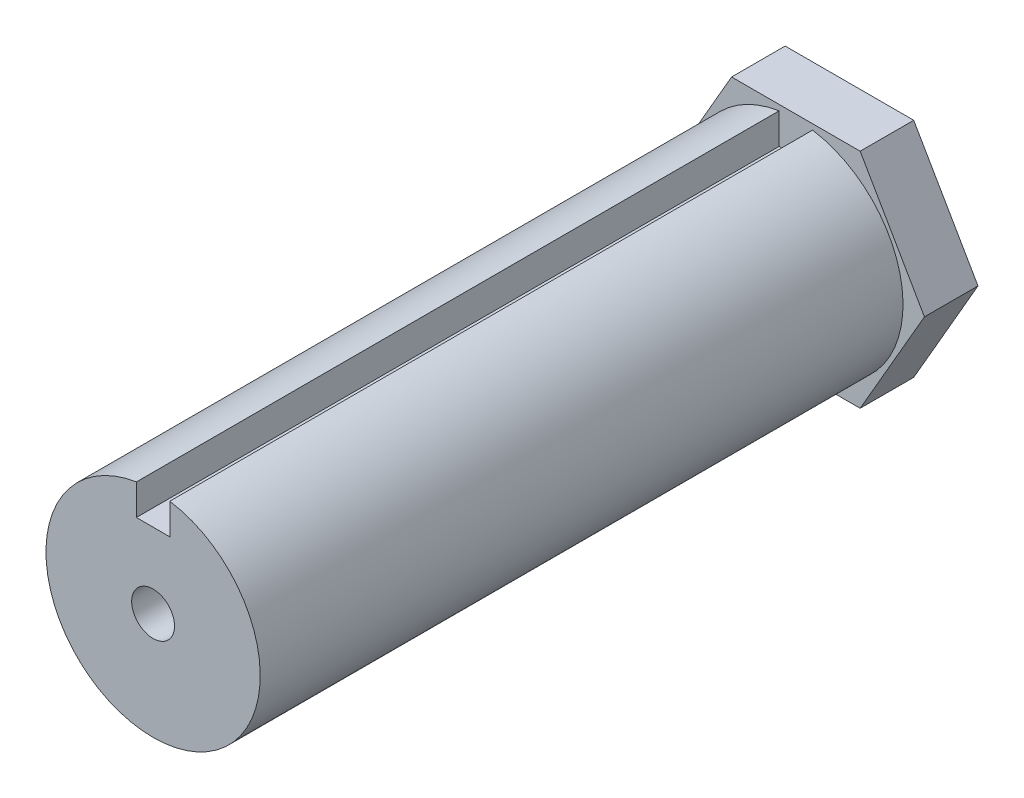
ISO-10303-21;
HEADER;
FILE_DESCRIPTION(('STEP AP214'),'2;1');
FILE_NAME('part.step','',(''),(''),'','','');
FILE_SCHEMA(('AUTOMOTIVE_DESIGN { 1 0 10303 214 1 1 1 1 }'));
ENDSEC;
DATA;
#1=APPLICATION_CONTEXT('core data for automotive mechanical design processes');
#2=APPLICATION_PROTOCOL_DEFINITION('international standard','automotive_design',2000,#1);
#3=PRODUCT_CONTEXT('',#1,'mechanical');
#4=PRODUCT('Part','Part','',(#3));
#5=PRODUCT_RELATED_PRODUCT_CATEGORY('part','',(#4));
#6=PRODUCT_DEFINITION_FORMATION('','',#4);
#7=PRODUCT_DEFINITION_CONTEXT('part definition',#1,'design');
#8=PRODUCT_DEFINITION('design','',#6,#7);
#9=PRODUCT_DEFINITION_SHAPE('','',#8);
#10=(LENGTH_UNIT() NAMED_UNIT(*) SI_UNIT(.MILLI.,.METRE.));
#11=(NAMED_UNIT(*) PLANE_ANGLE_UNIT() SI_UNIT($,.RADIAN.));
#12=(NAMED_UNIT(*) SI_UNIT($,.STERADIAN.) SOLID_ANGLE_UNIT());
#13=UNCERTAINTY_MEASURE_WITH_UNIT(LENGTH_MEASURE(1.E-05),#10,'distance_accuracy_value','');
#14=(GEOMETRIC_REPRESENTATION_CONTEXT(3) GLOBAL_UNCERTAINTY_ASSIGNED_CONTEXT((#13)) GLOBAL_UNIT_ASSIGNED_CONTEXT((#10,
#11,#12)) REPRESENTATION_CONTEXT('',''));
#15=CARTESIAN_POINT('',(0.,0.,0.));
#16=DIRECTION('',(0.,0.,1.));
#17=DIRECTION('',(1.,0.,0.));
#18=AXIS2_PLACEMENT_3D('',#15,#16,#17);
#19=CARTESIAN_POINT('',(12.,0.,5.));
#20=DIRECTION('',(-0.866025403784435,-0.500000000000007,0.));
#21=DIRECTION('',(0.500000000000007,-0.866025403784435,0.));
#22=AXIS2_PLACEMENT_3D('',#19,#20,#21);
#23=PLANE('',#22);
#24=DIRECTION('',(-0.500000000000007,0.866025403784435,0.));
#25=VECTOR('',#24,1.);
#26=CARTESIAN_POINT('',(12.,0.,0.));
#27=LINE('',#26,#25);
#28=CARTESIAN_POINT('',(12.,0.,0.));
#29=VERTEX_POINT('',#28);
#30=CARTESIAN_POINT('',(5.99999999999992,10.3923048454133,0.));
#31=VERTEX_POINT('',#30);
#32=EDGE_CURVE('E128',#29,#31,#27,.T.);
#33=ORIENTED_EDGE('',*,*,#32,.T.);
#34=DIRECTION('',(0.,0.,-1.));
#35=VECTOR('',#34,1.);
#36=CARTESIAN_POINT('',(5.99999999999992,10.3923048454133,5.));
#37=LINE('',#36,#35);
#38=CARTESIAN_POINT('',(5.99999999999992,10.3923048454133,5.));
#39=VERTEX_POINT('',#38);
#40=EDGE_CURVE('E39',#39,#31,#37,.T.);
#41=ORIENTED_EDGE('',*,*,#40,.F.);
#42=DIRECTION('',(-0.500000000000007,0.866025403784435,0.));
#43=VECTOR('',#42,1.);
#44=CARTESIAN_POINT('',(12.,0.,5.));
#45=LINE('',#44,#43);
#46=CARTESIAN_POINT('',(12.,0.,5.));
#47=VERTEX_POINT('',#46);
#48=EDGE_CURVE('E140',#47,#39,#45,.T.);
#49=ORIENTED_EDGE('',*,*,#48,.F.);
#50=DIRECTION('',(0.,0.,-1.));
#51=VECTOR('',#50,1.);
#52=CARTESIAN_POINT('',(12.,0.,5.));
#53=LINE('',#52,#51);
#54=EDGE_CURVE('E124',#47,#29,#53,.T.);
#55=ORIENTED_EDGE('',*,*,#54,.T.);
#56=EDGE_LOOP('',(#33,#41,#49,#55));
#57=FACE_BOUND('',#56,.T.);
#58=ADVANCED_FACE('F32',(#57),#23,.F.);
#59=CARTESIAN_POINT('',(5.99999999999992,10.3923048454133,5.));
#60=DIRECTION('',(0.,-1.,0.));
#61=DIRECTION('',(1.,0.,0.));
#62=AXIS2_PLACEMENT_3D('',#59,#60,#61);
#63=PLANE('',#62);
#64=DIRECTION('',(-1.,0.,0.));
#65=VECTOR('',#64,1.);
#66=CARTESIAN_POINT('',(5.99999999999992,10.3923048454133,0.));
#67=LINE('',#66,#65);
#68=CARTESIAN_POINT('',(-6.00000000000008,10.3923048454132,0.));
#69=VERTEX_POINT('',#68);
#70=EDGE_CURVE('E131',#31,#69,#67,.T.);
#71=ORIENTED_EDGE('',*,*,#70,.T.);
#72=DIRECTION('',(0.,0.,-1.));
#73=VECTOR('',#72,1.);
#74=CARTESIAN_POINT('',(-6.00000000000008,10.3923048454132,5.));
#75=LINE('',#74,#73);
#76=CARTESIAN_POINT('',(-6.00000000000008,10.3923048454132,5.));
#77=VERTEX_POINT('',#76);
#78=EDGE_CURVE('E144',#77,#69,#75,.T.);
#79=ORIENTED_EDGE('',*,*,#78,.F.);
#80=DIRECTION('',(-1.,0.,0.));
#81=VECTOR('',#80,1.);
#82=CARTESIAN_POINT('',(5.99999999999992,10.3923048454133,5.));
#83=LINE('',#82,#81);
#84=EDGE_CURVE('E90',#39,#77,#83,.T.);
#85=ORIENTED_EDGE('',*,*,#84,.F.);
#86=ORIENTED_EDGE('',*,*,#40,.T.);
#87=EDGE_LOOP('',(#71,#79,#85,#86));
#88=FACE_BOUND('',#87,.T.);
#89=ADVANCED_FACE('F147',(#88),#63,.F.);
#90=CARTESIAN_POINT('',(-6.00000000000008,10.3923048454132,5.));
#91=DIRECTION('',(0.866025403784443,-0.499999999999993,0.));
#92=DIRECTION('',(0.499999999999993,0.866025403784443,0.));
#93=AXIS2_PLACEMENT_3D('',#90,#91,#92);
#94=PLANE('',#93);
#95=DIRECTION('',(-0.499999999999993,-0.866025403784443,0.));
#96=VECTOR('',#95,1.);
#97=CARTESIAN_POINT('',(-6.00000000000008,10.3923048454132,0.));
#98=LINE('',#97,#96);
#99=CARTESIAN_POINT('',(-12.,0.,0.));
#100=VERTEX_POINT('',#99);
#101=EDGE_CURVE('E134',#69,#100,#98,.T.);
#102=ORIENTED_EDGE('',*,*,#101,.T.);
#103=DIRECTION('',(0.,0.,-1.));
#104=VECTOR('',#103,1.);
#105=CARTESIAN_POINT('',(-12.,0.,5.));
#106=LINE('',#105,#104);
#107=CARTESIAN_POINT('',(-12.,0.,5.));
#108=VERTEX_POINT('',#107);
#109=EDGE_CURVE('E119',#108,#100,#106,.T.);
#110=ORIENTED_EDGE('',*,*,#109,.F.);
#111=DIRECTION('',(-0.499999999999993,-0.866025403784443,0.));
#112=VECTOR('',#111,1.);
#113=CARTESIAN_POINT('',(-6.00000000000008,10.3923048454132,5.));
#114=LINE('',#113,#112);
#115=EDGE_CURVE('E107',#77,#108,#114,.T.);
#116=ORIENTED_EDGE('',*,*,#115,.F.);
#117=ORIENTED_EDGE('',*,*,#78,.T.);
#118=EDGE_LOOP('',(#102,#110,#116,#117));
#119=FACE_BOUND('',#118,.T.);
#120=ADVANCED_FACE('F155',(#119),#94,.F.);
#121=CARTESIAN_POINT('',(-12.,0.,5.));
#122=DIRECTION('',(0.866025403784434,0.500000000000007,0.));
#123=DIRECTION('',(-0.500000000000007,0.866025403784434,0.));
#124=AXIS2_PLACEMENT_3D('',#121,#122,#123);
#125=PLANE('',#124);
#126=DIRECTION('',(0.500000000000007,-0.866025403784434,0.));
#127=VECTOR('',#126,1.);
#128=CARTESIAN_POINT('',(-12.,0.,0.));
#129=LINE('',#128,#127);
#130=CARTESIAN_POINT('',(-5.99999999999991,-10.3923048454133,0.));
#131=VERTEX_POINT('',#130);
#132=EDGE_CURVE('E116',#100,#131,#129,.T.);
#133=ORIENTED_EDGE('',*,*,#132,.T.);
#134=DIRECTION('',(0.,0.,-1.));
#135=VECTOR('',#134,1.);
#136=CARTESIAN_POINT('',(-5.99999999999991,-10.3923048454133,5.));
#137=LINE('',#136,#135);
#138=CARTESIAN_POINT('',(-5.99999999999991,-10.3923048454133,5.));
#139=VERTEX_POINT('',#138);
#140=EDGE_CURVE('E113',#139,#131,#137,.T.);
#141=ORIENTED_EDGE('',*,*,#140,.F.);
#142=DIRECTION('',(0.500000000000007,-0.866025403784434,0.));
#143=VECTOR('',#142,1.);
#144=CARTESIAN_POINT('',(-12.,0.,5.));
#145=LINE('',#144,#143);
#146=EDGE_CURVE('E99',#108,#139,#145,.T.);
#147=ORIENTED_EDGE('',*,*,#146,.F.);
#148=ORIENTED_EDGE('',*,*,#109,.T.);
#149=EDGE_LOOP('',(#133,#141,#147,#148));
#150=FACE_BOUND('',#149,.T.);
#151=ADVANCED_FACE('F114',(#150),#125,.F.);
#152=CARTESIAN_POINT('',(-5.99999999999991,-10.3923048454133,5.));
#153=DIRECTION('',(0.,1.,0.));
#154=DIRECTION('',(-1.,0.,0.));
#155=AXIS2_PLACEMENT_3D('',#152,#153,#154);
#156=PLANE('',#155);
#157=DIRECTION('',(1.,0.,0.));
#158=VECTOR('',#157,1.);
#159=CARTESIAN_POINT('',(-5.99999999999991,-10.3923048454133,0.));
#160=LINE('',#159,#158);
#161=CARTESIAN_POINT('',(6.00000000000008,-10.3923048454132,0.));
#162=VERTEX_POINT('',#161);
#163=EDGE_CURVE('E137',#131,#162,#160,.T.);
#164=ORIENTED_EDGE('',*,*,#163,.T.);
#165=DIRECTION('',(0.,0.,-1.));
#166=VECTOR('',#165,1.);
#167=CARTESIAN_POINT('',(6.00000000000008,-10.3923048454132,5.));
#168=LINE('',#167,#166);
#169=CARTESIAN_POINT('',(6.00000000000008,-10.3923048454132,5.));
#170=VERTEX_POINT('',#169);
#171=EDGE_CURVE('E120',#170,#162,#168,.T.);
#172=ORIENTED_EDGE('',*,*,#171,.F.);
#173=DIRECTION('',(1.,0.,0.));
#174=VECTOR('',#173,1.);
#175=CARTESIAN_POINT('',(-5.99999999999991,-10.3923048454133,5.));
#176=LINE('',#175,#174);
#177=EDGE_CURVE('E104',#139,#170,#176,.T.);
#178=ORIENTED_EDGE('',*,*,#177,.F.);
#179=ORIENTED_EDGE('',*,*,#140,.T.);
#180=EDGE_LOOP('',(#164,#172,#178,#179));
#181=FACE_BOUND('',#180,.T.);
#182=ADVANCED_FACE('F122',(#181),#156,.F.);
#183=CARTESIAN_POINT('',(6.00000000000008,-10.3923048454132,5.));
#184=DIRECTION('',(-0.866025403784443,0.499999999999993,0.));
#185=DIRECTION('',(-0.499999999999993,-0.866025403784443,0.));
#186=AXIS2_PLACEMENT_3D('',#183,#184,#185);
#187=PLANE('',#186);
#188=DIRECTION('',(0.499999999999993,0.866025403784443,0.));
#189=VECTOR('',#188,1.);
#190=CARTESIAN_POINT('',(6.00000000000008,-10.3923048454132,0.));
#191=LINE('',#190,#189);
#192=EDGE_CURVE('E81',#162,#29,#191,.T.);
#193=ORIENTED_EDGE('',*,*,#192,.T.);
#194=ORIENTED_EDGE('',*,*,#54,.F.);
#195=DIRECTION('',(0.499999999999993,0.866025403784443,0.));
#196=VECTOR('',#195,1.);
#197=CARTESIAN_POINT('',(6.00000000000008,-10.3923048454132,5.));
#198=LINE('',#197,#196);
#199=EDGE_CURVE('E54',#170,#47,#198,.T.);
#200=ORIENTED_EDGE('',*,*,#199,.F.);
#201=ORIENTED_EDGE('',*,*,#171,.T.);
#202=EDGE_LOOP('',(#193,#194,#200,#201));
#203=FACE_BOUND('',#202,.T.);
#204=ADVANCED_FACE('F252',(#203),#187,.F.);
#205=CARTESIAN_POINT('',(0.,0.,5.));
#206=DIRECTION('',(0.,0.,1.));
#207=DIRECTION('',(1.,0.,0.));
#208=AXIS2_PLACEMENT_3D('',#205,#206,#207);
#209=PLANE('',#208);
#210=ORIENTED_EDGE('',*,*,#84,.T.);
#211=ORIENTED_EDGE('',*,*,#115,.T.);
#212=ORIENTED_EDGE('',*,*,#146,.T.);
#213=ORIENTED_EDGE('',*,*,#177,.T.);
#214=ORIENTED_EDGE('',*,*,#199,.T.);
#215=ORIENTED_EDGE('',*,*,#48,.T.);
#216=EDGE_LOOP('',(#210,#211,#212,#213,#214,#215));
#217=FACE_BOUND('',#216,.T.);
#218=DIRECTION('',(0.,1.,0.));
#219=VECTOR('',#218,1.);
#220=CARTESIAN_POINT('',(1.55966844450006,7.,5.));
#221=LINE('',#220,#219);
#222=CARTESIAN_POINT('',(1.55966844450006,7.,5.));
#223=VERTEX_POINT('',#222);
#224=CARTESIAN_POINT('',(1.55966844450006,9.87762290954817,5.));
#225=VERTEX_POINT('',#224);
#226=EDGE_CURVE('E184',#223,#225,#221,.T.);
#227=ORIENTED_EDGE('',*,*,#226,.T.);
#228=CARTESIAN_POINT('',(0.,0.,5.));
#229=DIRECTION('',(0.,0.,1.));
#230=DIRECTION('',(1.,0.,0.));
#231=AXIS2_PLACEMENT_3D('',#228,#229,#230);
#232=CIRCLE('',#231,10.);
#233=CARTESIAN_POINT('',(-1.55966844450006,9.87762290954817,5.));
#234=VERTEX_POINT('',#233);
#235=EDGE_CURVE('E159',#234,#225,#232,.T.);
#236=ORIENTED_EDGE('',*,*,#235,.F.);
#237=DIRECTION('',(0.,-1.,0.));
#238=VECTOR('',#237,1.);
#239=CARTESIAN_POINT('',(-1.55966844450006,7.,5.));
#240=LINE('',#239,#238);
#241=CARTESIAN_POINT('',(-1.55966844450006,7.,5.));
#242=VERTEX_POINT('',#241);
#243=EDGE_CURVE('E190',#234,#242,#240,.T.);
#244=ORIENTED_EDGE('',*,*,#243,.T.);
#245=DIRECTION('',(1.,0.,0.));
#246=VECTOR('',#245,1.);
#247=CARTESIAN_POINT('',(-1.55966844450006,7.,5.));
#248=LINE('',#247,#246);
#249=EDGE_CURVE('E178',#242,#223,#248,.T.);
#250=ORIENTED_EDGE('',*,*,#249,.T.);
#251=EDGE_LOOP('',(#227,#236,#244,#250));
#252=FACE_BOUND('',#251,.T.);
#253=ADVANCED_FACE('F101',(#217,#252),#209,.T.);
#254=CARTESIAN_POINT('',(0.,0.,0.));
#255=DIRECTION('',(0.,0.,1.));
#256=DIRECTION('',(1.,0.,0.));
#257=AXIS2_PLACEMENT_3D('',#254,#255,#256);
#258=PLANE('',#257);
#259=ORIENTED_EDGE('',*,*,#32,.F.);
#260=ORIENTED_EDGE('',*,*,#192,.F.);
#261=ORIENTED_EDGE('',*,*,#163,.F.);
#262=ORIENTED_EDGE('',*,*,#132,.F.);
#263=ORIENTED_EDGE('',*,*,#101,.F.);
#264=ORIENTED_EDGE('',*,*,#70,.F.);
#265=EDGE_LOOP('',(#259,#260,#261,#262,#263,#264));
#266=FACE_BOUND('',#265,.T.);
#267=ADVANCED_FACE('F152',(#266),#258,.F.);
#268=CARTESIAN_POINT('',(0.,0.,65.));
#269=DIRECTION('',(0.,0.,-1.));
#270=DIRECTION('',(-1.,0.,0.));
#271=AXIS2_PLACEMENT_3D('',#268,#269,#270);
#272=CYLINDRICAL_SURFACE('',#271,10.);
#273=ORIENTED_EDGE('',*,*,#235,.T.);
#274=DIRECTION('',(0.,0.,-1.));
#275=VECTOR('',#274,1.);
#276=CARTESIAN_POINT('',(1.55966844450006,9.87762290954817,65.));
#277=LINE('',#276,#275);
#278=CARTESIAN_POINT('',(1.55966844450006,9.87762290954817,65.));
#279=VERTEX_POINT('',#278);
#280=EDGE_CURVE('E168',#225,#279,#277,.F.);
#281=ORIENTED_EDGE('',*,*,#280,.T.);
#282=CARTESIAN_POINT('',(0.,0.,65.));
#283=DIRECTION('',(0.,0.,1.));
#284=DIRECTION('',(1.,0.,0.));
#285=AXIS2_PLACEMENT_3D('',#282,#283,#284);
#286=CIRCLE('',#285,10.);
#287=CARTESIAN_POINT('',(-1.55966844450006,9.87762290954817,65.));
#288=VERTEX_POINT('',#287);
#289=EDGE_CURVE('E132',#288,#279,#286,.T.);
#290=ORIENTED_EDGE('',*,*,#289,.F.);
#291=DIRECTION('',(0.,0.,-1.));
#292=VECTOR('',#291,1.);
#293=CARTESIAN_POINT('',(-1.55966844450006,9.87762290954817,65.));
#294=LINE('',#293,#292);
#295=EDGE_CURVE('E45',#288,#234,#294,.T.);
#296=ORIENTED_EDGE('',*,*,#295,.T.);
#297=EDGE_LOOP('',(#273,#281,#290,#296));
#298=FACE_BOUND('',#297,.T.);
#299=ADVANCED_FACE('F203',(#298),#272,.T.);
#300=CARTESIAN_POINT('',(0.,0.,65.));
#301=DIRECTION('',(0.,0.,1.));
#302=DIRECTION('',(1.,0.,0.));
#303=AXIS2_PLACEMENT_3D('',#300,#301,#302);
#304=PLANE('',#303);
#305=DIRECTION('',(0.,1.,0.));
#306=VECTOR('',#305,1.);
#307=CARTESIAN_POINT('',(1.55966844450006,7.,65.));
#308=LINE('',#307,#306);
#309=CARTESIAN_POINT('',(1.55966844450006,7.,65.));
#310=VERTEX_POINT('',#309);
#311=EDGE_CURVE('E185',#310,#279,#308,.T.);
#312=ORIENTED_EDGE('',*,*,#311,.F.);
#313=DIRECTION('',(1.,0.,0.));
#314=VECTOR('',#313,1.);
#315=CARTESIAN_POINT('',(-1.55966844450006,7.,65.));
#316=LINE('',#315,#314);
#317=CARTESIAN_POINT('',(-1.55966844450006,7.,65.));
#318=VERTEX_POINT('',#317);
#319=EDGE_CURVE('E181',#318,#310,#316,.T.);
#320=ORIENTED_EDGE('',*,*,#319,.F.);
#321=DIRECTION('',(0.,-1.,0.));
#322=VECTOR('',#321,1.);
#323=CARTESIAN_POINT('',(-1.55966844450006,0.,65.));
#324=LINE('',#323,#322);
#325=EDGE_CURVE('E11',#288,#318,#324,.T.);
#326=ORIENTED_EDGE('',*,*,#325,.F.);
#327=ORIENTED_EDGE('',*,*,#289,.T.);
#328=EDGE_LOOP('',(#312,#320,#326,#327));
#329=FACE_BOUND('',#328,.T.);
#330=CARTESIAN_POINT('',(0.,0.,65.));
#331=DIRECTION('',(0.,0.,1.));
#332=DIRECTION('',(1.,0.,0.));
#333=AXIS2_PLACEMENT_3D('',#330,#331,#332);
#334=CIRCLE('',#333,2.);
#335=CARTESIAN_POINT('',(2.,0.,65.));
#336=VERTEX_POINT('',#335);
#337=EDGE_CURVE('E165',#336,#336,#334,.T.);
#338=ORIENTED_EDGE('',*,*,#337,.F.);
#339=EDGE_LOOP('',(#338));
#340=FACE_BOUND('',#339,.T.);
#341=ADVANCED_FACE('F222',(#329,#340),#304,.T.);
#342=CARTESIAN_POINT('',(0.,0.,45.));
#343=DIRECTION('',(0.,0.,1.));
#344=DIRECTION('',(1.,0.,0.));
#345=AXIS2_PLACEMENT_3D('',#342,#343,#344);
#346=CYLINDRICAL_SURFACE('',#345,2.);
#347=CARTESIAN_POINT('',(0.,0.,45.));
#348=DIRECTION('',(0.,0.,1.));
#349=DIRECTION('',(1.,0.,0.));
#350=AXIS2_PLACEMENT_3D('',#347,#348,#349);
#351=CIRCLE('',#350,2.);
#352=CARTESIAN_POINT('',(2.,0.,45.));
#353=VERTEX_POINT('',#352);
#354=EDGE_CURVE('E162',#353,#353,#351,.T.);
#355=ORIENTED_EDGE('',*,*,#354,.F.);
#356=EDGE_LOOP('',(#355));
#357=FACE_BOUND('',#356,.T.);
#358=ORIENTED_EDGE('',*,*,#337,.T.);
#359=EDGE_LOOP('',(#358));
#360=FACE_BOUND('',#359,.T.);
#361=ADVANCED_FACE('F225',(#357,#360),#346,.F.);
#362=CARTESIAN_POINT('',(0.,0.,45.));
#363=DIRECTION('',(0.,0.,1.));
#364=DIRECTION('',(1.,0.,0.));
#365=AXIS2_PLACEMENT_3D('',#362,#363,#364);
#366=PLANE('',#365);
#367=ORIENTED_EDGE('',*,*,#354,.T.);
#368=EDGE_LOOP('',(#367));
#369=FACE_BOUND('',#368,.T.);
#370=ADVANCED_FACE('F230',(#369),#366,.T.);
#371=CARTESIAN_POINT('',(1.55966844450006,7.,5.));
#372=DIRECTION('',(1.,0.,0.));
#373=DIRECTION('',(0.,1.,0.));
#374=AXIS2_PLACEMENT_3D('',#371,#372,#373);
#375=PLANE('',#374);
#376=ORIENTED_EDGE('',*,*,#226,.F.);
#377=DIRECTION('',(0.,0.,1.));
#378=VECTOR('',#377,1.);
#379=CARTESIAN_POINT('',(1.55966844450006,7.,5.));
#380=LINE('',#379,#378);
#381=EDGE_CURVE('E174',#223,#310,#380,.T.);
#382=ORIENTED_EDGE('',*,*,#381,.T.);
#383=ORIENTED_EDGE('',*,*,#311,.T.);
#384=ORIENTED_EDGE('',*,*,#280,.F.);
#385=EDGE_LOOP('',(#376,#382,#383,#384));
#386=FACE_BOUND('',#385,.T.);
#387=ADVANCED_FACE('F220',(#386),#375,.F.);
#388=CARTESIAN_POINT('',(-1.55966844450006,7.,5.));
#389=DIRECTION('',(-1.,0.,0.));
#390=DIRECTION('',(0.,0.,1.));
#391=AXIS2_PLACEMENT_3D('',#388,#389,#390);
#392=PLANE('',#391);
#393=ORIENTED_EDGE('',*,*,#325,.T.);
#394=DIRECTION('',(0.,0.,1.));
#395=VECTOR('',#394,1.);
#396=CARTESIAN_POINT('',(-1.55966844450006,7.,5.));
#397=LINE('',#396,#395);
#398=EDGE_CURVE('E175',#242,#318,#397,.T.);
#399=ORIENTED_EDGE('',*,*,#398,.F.);
#400=ORIENTED_EDGE('',*,*,#243,.F.);
#401=ORIENTED_EDGE('',*,*,#295,.F.);
#402=EDGE_LOOP('',(#393,#399,#400,#401));
#403=FACE_BOUND('',#402,.T.);
#404=ADVANCED_FACE('F215',(#403),#392,.F.);
#405=CARTESIAN_POINT('',(-1.55966844450006,7.,5.));
#406=DIRECTION('',(0.,-1.,0.));
#407=DIRECTION('',(1.,0.,0.));
#408=AXIS2_PLACEMENT_3D('',#405,#406,#407);
#409=PLANE('',#408);
#410=ORIENTED_EDGE('',*,*,#319,.T.);
#411=ORIENTED_EDGE('',*,*,#381,.F.);
#412=ORIENTED_EDGE('',*,*,#249,.F.);
#413=ORIENTED_EDGE('',*,*,#398,.T.);
#414=EDGE_LOOP('',(#410,#411,#412,#413));
#415=FACE_BOUND('',#414,.T.);
#416=ADVANCED_FACE('F218',(#415),#409,.F.);
#417=CLOSED_SHELL('',(#58,#89,#120,#151,#182,#204,#253,#267,#299,#341,#361,#370,#387,#404,#416));
#418=MANIFOLD_SOLID_BREP('B2',#417);
#419=ADVANCED_BREP_SHAPE_REPRESENTATION('',(#18,#418),#14);
#420=SHAPE_DEFINITION_REPRESENTATION(#9,#419);
ENDSEC;
END-ISO-10303-21;
